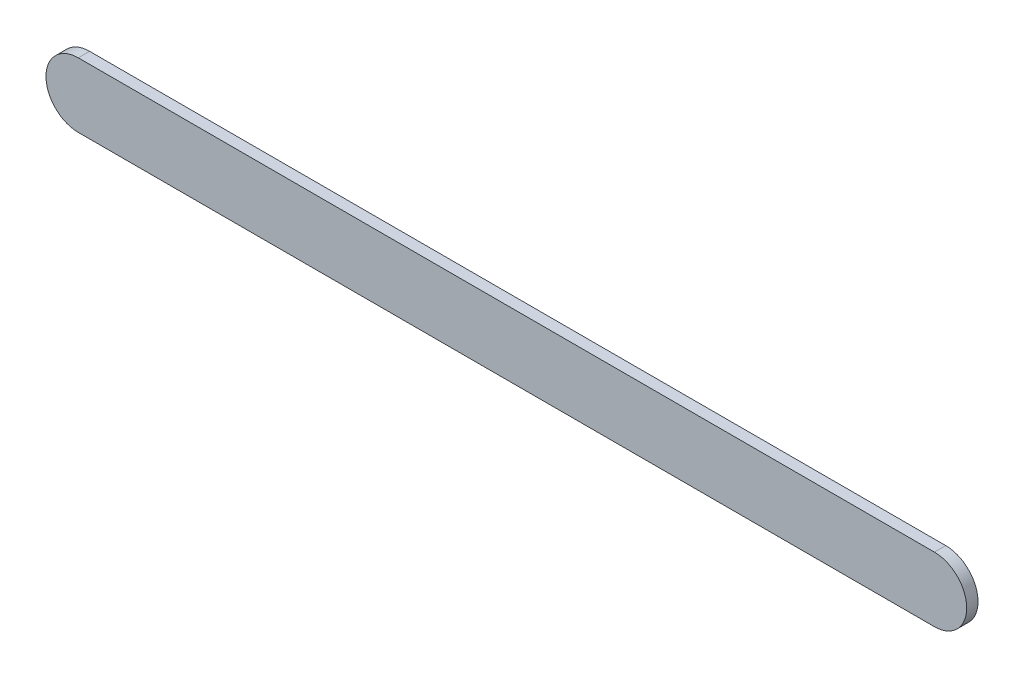
ISO-10303-21;
HEADER;
FILE_DESCRIPTION(('STEP AP214'),'2;1');
FILE_NAME('part.step','',(''),(''),'','','');
FILE_SCHEMA(('AUTOMOTIVE_DESIGN { 1 0 10303 214 1 1 1 1 }'));
ENDSEC;
DATA;
#1=APPLICATION_CONTEXT('core data for automotive mechanical design processes');
#2=APPLICATION_PROTOCOL_DEFINITION('international standard','automotive_design',2000,#1);
#3=PRODUCT_CONTEXT('',#1,'mechanical');
#4=PRODUCT('Part','Part','',(#3));
#5=PRODUCT_RELATED_PRODUCT_CATEGORY('part','',(#4));
#6=PRODUCT_DEFINITION_FORMATION('','',#4);
#7=PRODUCT_DEFINITION_CONTEXT('part definition',#1,'design');
#8=PRODUCT_DEFINITION('design','',#6,#7);
#9=PRODUCT_DEFINITION_SHAPE('','',#8);
#10=(LENGTH_UNIT() NAMED_UNIT(*) SI_UNIT(.MILLI.,.METRE.));
#11=(NAMED_UNIT(*) PLANE_ANGLE_UNIT() SI_UNIT($,.RADIAN.));
#12=(NAMED_UNIT(*) SI_UNIT($,.STERADIAN.) SOLID_ANGLE_UNIT());
#13=UNCERTAINTY_MEASURE_WITH_UNIT(LENGTH_MEASURE(1.E-05),#10,'distance_accuracy_value','');
#14=(GEOMETRIC_REPRESENTATION_CONTEXT(3) GLOBAL_UNCERTAINTY_ASSIGNED_CONTEXT((#13)) GLOBAL_UNIT_ASSIGNED_CONTEXT((#10,
#11,#12)) REPRESENTATION_CONTEXT('',''));
#15=CARTESIAN_POINT('',(0.,0.,0.));
#16=DIRECTION('',(0.,0.,1.));
#17=DIRECTION('',(1.,0.,0.));
#18=AXIS2_PLACEMENT_3D('',#15,#16,#17);
#19=CARTESIAN_POINT('',(80.7,-133.35,1.635));
#20=DIRECTION('',(0.,0.,1.));
#21=DIRECTION('',(1.,0.,0.));
#22=AXIS2_PLACEMENT_3D('',#19,#20,#21);
#23=PLANE('',#22);
#24=DIRECTION('',(1.,0.,0.));
#25=VECTOR('',#24,1.);
#26=CARTESIAN_POINT('',(80.7,-133.35,1.635));
#27=LINE('',#26,#25);
#28=CARTESIAN_POINT('',(80.7,-133.35,1.635));
#29=VERTEX_POINT('',#28);
#30=CARTESIAN_POINT('',(83.35,-133.35,1.635));
#31=VERTEX_POINT('',#30);
#32=EDGE_CURVE('E82',#29,#31,#27,.T.);
#33=ORIENTED_EDGE('',*,*,#32,.T.);
#34=CARTESIAN_POINT('',(83.35,-133.25,1.635));
#35=DIRECTION('',(0.,0.,1.));
#36=DIRECTION('',(0.,-1.,0.));
#37=AXIS2_PLACEMENT_3D('',#34,#35,#36);
#38=CIRCLE('',#37,0.1);
#39=CARTESIAN_POINT('',(83.35,-133.15,1.635));
#40=VERTEX_POINT('',#39);
#41=EDGE_CURVE('E109',#31,#40,#38,.T.);
#42=ORIENTED_EDGE('',*,*,#41,.T.);
#43=DIRECTION('',(-1.,0.,0.));
#44=VECTOR('',#43,1.);
#45=CARTESIAN_POINT('',(83.35,-133.15,1.635));
#46=LINE('',#45,#44);
#47=CARTESIAN_POINT('',(80.7,-133.15,1.635));
#48=VERTEX_POINT('',#47);
#49=EDGE_CURVE('E75',#40,#48,#46,.T.);
#50=ORIENTED_EDGE('',*,*,#49,.T.);
#51=CARTESIAN_POINT('',(80.7,-133.25,1.635));
#52=DIRECTION('',(0.,0.,1.));
#53=DIRECTION('',(-1.42108547152E-13,1.,0.));
#54=AXIS2_PLACEMENT_3D('',#51,#52,#53);
#55=CIRCLE('',#54,0.1);
#56=EDGE_CURVE('E11',#48,#29,#55,.T.);
#57=ORIENTED_EDGE('',*,*,#56,.T.);
#58=EDGE_LOOP('',(#33,#42,#50,#57));
#59=FACE_BOUND('',#58,.T.);
#60=ADVANCED_FACE('F17',(#59),#23,.T.);
#61=CARTESIAN_POINT('',(80.7,-133.35,1.6));
#62=DIRECTION('',(0.,0.,1.));
#63=DIRECTION('',(1.,0.,0.));
#64=AXIS2_PLACEMENT_3D('',#61,#62,#63);
#65=PLANE('',#64);
#66=CARTESIAN_POINT('',(80.7,-133.25,1.6));
#67=DIRECTION('',(0.,0.,1.));
#68=DIRECTION('',(-1.42108547152E-13,1.,0.));
#69=AXIS2_PLACEMENT_3D('',#66,#67,#68);
#70=CIRCLE('',#69,0.1);
#71=CARTESIAN_POINT('',(80.7,-133.15,1.6));
#72=VERTEX_POINT('',#71);
#73=CARTESIAN_POINT('',(80.7,-133.35,1.6));
#74=VERTEX_POINT('',#73);
#75=EDGE_CURVE('E20',#72,#74,#70,.T.);
#76=ORIENTED_EDGE('',*,*,#75,.F.);
#77=DIRECTION('',(-1.,0.,0.));
#78=VECTOR('',#77,1.);
#79=CARTESIAN_POINT('',(83.35,-133.15,1.6));
#80=LINE('',#79,#78);
#81=CARTESIAN_POINT('',(83.35,-133.15,1.6));
#82=VERTEX_POINT('',#81);
#83=EDGE_CURVE('E105',#82,#72,#80,.T.);
#84=ORIENTED_EDGE('',*,*,#83,.F.);
#85=CARTESIAN_POINT('',(83.35,-133.25,1.6));
#86=DIRECTION('',(0.,0.,1.));
#87=DIRECTION('',(0.,-1.,0.));
#88=AXIS2_PLACEMENT_3D('',#85,#86,#87);
#89=CIRCLE('',#88,0.1);
#90=CARTESIAN_POINT('',(83.35,-133.35,1.6));
#91=VERTEX_POINT('',#90);
#92=EDGE_CURVE('E84',#91,#82,#89,.T.);
#93=ORIENTED_EDGE('',*,*,#92,.F.);
#94=DIRECTION('',(1.,0.,0.));
#95=VECTOR('',#94,1.);
#96=CARTESIAN_POINT('',(80.7,-133.35,1.6));
#97=LINE('',#96,#95);
#98=EDGE_CURVE('E80',#74,#91,#97,.T.);
#99=ORIENTED_EDGE('',*,*,#98,.F.);
#100=EDGE_LOOP('',(#76,#84,#93,#99));
#101=FACE_BOUND('',#100,.T.);
#102=ADVANCED_FACE('F86',(#101),#65,.F.);
#103=CARTESIAN_POINT('',(80.7,-133.25,1.6));
#104=DIRECTION('',(0.,0.,-1.));
#105=DIRECTION('',(-1.42108547152E-13,1.,0.));
#106=AXIS2_PLACEMENT_3D('',#103,#104,#105);
#107=CYLINDRICAL_SURFACE('',#106,0.1);
#108=ORIENTED_EDGE('',*,*,#75,.T.);
#109=DIRECTION('',(0.,0.,1.));
#110=VECTOR('',#109,1.);
#111=CARTESIAN_POINT('',(80.7,-133.35,1.6));
#112=LINE('',#111,#110);
#113=EDGE_CURVE('E69',#74,#29,#112,.T.);
#114=ORIENTED_EDGE('',*,*,#113,.T.);
#115=ORIENTED_EDGE('',*,*,#56,.F.);
#116=DIRECTION('',(0.,0.,1.));
#117=VECTOR('',#116,1.);
#118=CARTESIAN_POINT('',(80.7,-133.15,1.6));
#119=LINE('',#118,#117);
#120=EDGE_CURVE('E72',#72,#48,#119,.T.);
#121=ORIENTED_EDGE('',*,*,#120,.F.);
#122=EDGE_LOOP('',(#108,#114,#115,#121));
#123=FACE_BOUND('',#122,.T.);
#124=ADVANCED_FACE('F68',(#123),#107,.T.);
#125=CARTESIAN_POINT('',(83.35,-133.15,1.6));
#126=DIRECTION('',(0.,-1.,0.));
#127=DIRECTION('',(0.,0.,-1.));
#128=AXIS2_PLACEMENT_3D('',#125,#126,#127);
#129=PLANE('',#128);
#130=ORIENTED_EDGE('',*,*,#83,.T.);
#131=ORIENTED_EDGE('',*,*,#120,.T.);
#132=ORIENTED_EDGE('',*,*,#49,.F.);
#133=DIRECTION('',(0.,0.,1.));
#134=VECTOR('',#133,1.);
#135=CARTESIAN_POINT('',(83.35,-133.15,1.6));
#136=LINE('',#135,#134);
#137=EDGE_CURVE('E102',#82,#40,#136,.T.);
#138=ORIENTED_EDGE('',*,*,#137,.F.);
#139=EDGE_LOOP('',(#130,#131,#132,#138));
#140=FACE_BOUND('',#139,.T.);
#141=ADVANCED_FACE('F120',(#140),#129,.F.);
#142=CARTESIAN_POINT('',(83.35,-133.25,1.6));
#143=DIRECTION('',(0.,0.,-1.));
#144=DIRECTION('',(0.,-1.,0.));
#145=AXIS2_PLACEMENT_3D('',#142,#143,#144);
#146=CYLINDRICAL_SURFACE('',#145,0.1);
#147=ORIENTED_EDGE('',*,*,#92,.T.);
#148=ORIENTED_EDGE('',*,*,#137,.T.);
#149=ORIENTED_EDGE('',*,*,#41,.F.);
#150=DIRECTION('',(0.,0.,1.));
#151=VECTOR('',#150,1.);
#152=CARTESIAN_POINT('',(83.35,-133.35,1.6));
#153=LINE('',#152,#151);
#154=EDGE_CURVE('E90',#91,#31,#153,.T.);
#155=ORIENTED_EDGE('',*,*,#154,.F.);
#156=EDGE_LOOP('',(#147,#148,#149,#155));
#157=FACE_BOUND('',#156,.T.);
#158=ADVANCED_FACE('F122',(#157),#146,.T.);
#159=CARTESIAN_POINT('',(80.7,-133.35,1.6));
#160=DIRECTION('',(0.,1.,0.));
#161=DIRECTION('',(1.,0.,0.));
#162=AXIS2_PLACEMENT_3D('',#159,#160,#161);
#163=PLANE('',#162);
#164=ORIENTED_EDGE('',*,*,#98,.T.);
#165=ORIENTED_EDGE('',*,*,#154,.T.);
#166=ORIENTED_EDGE('',*,*,#32,.F.);
#167=ORIENTED_EDGE('',*,*,#113,.F.);
#168=EDGE_LOOP('',(#164,#165,#166,#167));
#169=FACE_BOUND('',#168,.T.);
#170=ADVANCED_FACE('F78',(#169),#163,.F.);
#171=CLOSED_SHELL('',(#60,#102,#124,#141,#158,#170));
#172=MANIFOLD_SOLID_BREP('B1',#171);
#173=ADVANCED_BREP_SHAPE_REPRESENTATION('',(#18,#172),#14);
#174=SHAPE_DEFINITION_REPRESENTATION(#9,#173);
ENDSEC;
END-ISO-10303-21;
